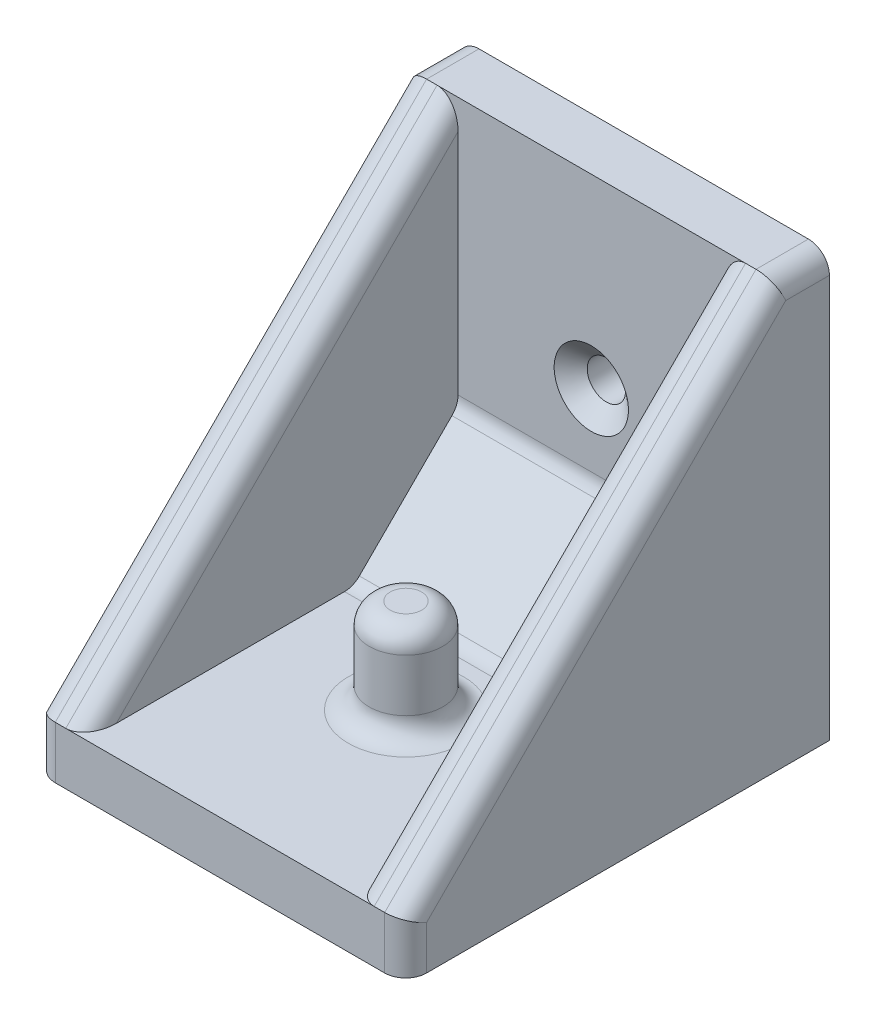
ISO-10303-21;
HEADER;
FILE_DESCRIPTION(('STEP AP214'),'2;1');
FILE_NAME('part.step','',(''),(''),'','','');
FILE_SCHEMA(('AUTOMOTIVE_DESIGN { 1 0 10303 214 1 1 1 1 }'));
ENDSEC;
DATA;
#1=APPLICATION_CONTEXT('core data for automotive mechanical design processes');
#2=APPLICATION_PROTOCOL_DEFINITION('international standard','automotive_design',2000,#1);
#3=PRODUCT_CONTEXT('',#1,'mechanical');
#4=PRODUCT('Part','Part','',(#3));
#5=PRODUCT_RELATED_PRODUCT_CATEGORY('part','',(#4));
#6=PRODUCT_DEFINITION_FORMATION('','',#4);
#7=PRODUCT_DEFINITION_CONTEXT('part definition',#1,'design');
#8=PRODUCT_DEFINITION('design','',#6,#7);
#9=PRODUCT_DEFINITION_SHAPE('','',#8);
#10=(LENGTH_UNIT() NAMED_UNIT(*) SI_UNIT(.MILLI.,.METRE.));
#11=(NAMED_UNIT(*) PLANE_ANGLE_UNIT() SI_UNIT($,.RADIAN.));
#12=(NAMED_UNIT(*) SI_UNIT($,.STERADIAN.) SOLID_ANGLE_UNIT());
#13=UNCERTAINTY_MEASURE_WITH_UNIT(LENGTH_MEASURE(1.E-05),#10,'distance_accuracy_value','');
#14=(GEOMETRIC_REPRESENTATION_CONTEXT(3) GLOBAL_UNCERTAINTY_ASSIGNED_CONTEXT((#13)) GLOBAL_UNIT_ASSIGNED_CONTEXT((#10,
#11,#12)) REPRESENTATION_CONTEXT('',''));
#15=CARTESIAN_POINT('',(0.,0.,0.));
#16=DIRECTION('',(0.,0.,1.));
#17=DIRECTION('',(1.,0.,0.));
#18=AXIS2_PLACEMENT_3D('',#15,#16,#17);
#19=CARTESIAN_POINT('',(0.,0.,5.));
#20=DIRECTION('',(0.,0.,-1.));
#21=DIRECTION('',(-1.,0.,0.));
#22=AXIS2_PLACEMENT_3D('',#19,#20,#21);
#23=PLANE('',#22);
#24=CARTESIAN_POINT('',(17.71,17.71,5.));
#25=DIRECTION('',(0.,0.,1.));
#26=DIRECTION('',(1.,0.,0.));
#27=AXIS2_PLACEMENT_3D('',#24,#25,#26);
#28=CIRCLE('',#27,3.5433);
#29=CARTESIAN_POINT('',(21.2533,17.71,5.));
#30=VERTEX_POINT('',#29);
#31=EDGE_CURVE('E424',#30,#30,#28,.T.);
#32=ORIENTED_EDGE('',*,*,#31,.F.);
#33=EDGE_LOOP('',(#32));
#34=FACE_BOUND('',#33,.T.);
#35=DIRECTION('',(0.,-1.,0.));
#36=VECTOR('',#35,1.);
#37=CARTESIAN_POINT('',(5.,0.,5.));
#38=LINE('',#37,#36);
#39=CARTESIAN_POINT('',(5.,32.5915728752538,5.));
#40=VERTEX_POINT('',#39);
#41=CARTESIAN_POINT('',(5.,10.8284271247463,5.));
#42=VERTEX_POINT('',#41);
#43=EDGE_CURVE('E404',#40,#42,#38,.T.);
#44=ORIENTED_EDGE('',*,*,#43,.T.);
#45=DIRECTION('',(-1.,0.,0.));
#46=VECTOR('',#45,1.);
#47=CARTESIAN_POINT('',(30.42,10.8284271247463,5.));
#48=LINE('',#47,#46);
#49=CARTESIAN_POINT('',(30.42,10.8284271247463,5.));
#50=VERTEX_POINT('',#49);
#51=EDGE_CURVE('E235',#42,#50,#48,.F.);
#52=ORIENTED_EDGE('',*,*,#51,.T.);
#53=DIRECTION('',(0.,1.,0.));
#54=VECTOR('',#53,1.);
#55=CARTESIAN_POINT('',(30.42,35.42,5.));
#56=LINE('',#55,#54);
#57=CARTESIAN_POINT('',(30.42,32.5915728752538,5.));
#58=VERTEX_POINT('',#57);
#59=EDGE_CURVE('E408',#50,#58,#56,.T.);
#60=ORIENTED_EDGE('',*,*,#59,.T.);
#61=CARTESIAN_POINT('',(32.42,32.5915728752538,5.));
#62=DIRECTION('',(0.,0.,-1.));
#63=DIRECTION('',(0.,1.,0.));
#64=AXIS2_PLACEMENT_3D('',#61,#62,#63);
#65=ELLIPSE('',#64,2.82842712474619,2.);
#66=CARTESIAN_POINT('',(32.42,35.42,5.));
#67=VERTEX_POINT('',#66);
#68=EDGE_CURVE('E11',#58,#67,#65,.T.);
#69=ORIENTED_EDGE('',*,*,#68,.T.);
#70=DIRECTION('',(-1.,0.,0.));
#71=VECTOR('',#70,1.);
#72=CARTESIAN_POINT('',(5.,35.42,5.));
#73=LINE('',#72,#71);
#74=CARTESIAN_POINT('',(3.,35.42,5.));
#75=VERTEX_POINT('',#74);
#76=EDGE_CURVE('E204',#67,#75,#73,.T.);
#77=ORIENTED_EDGE('',*,*,#76,.T.);
#78=CARTESIAN_POINT('',(3.,32.5915728752538,5.));
#79=DIRECTION('',(0.,0.,-1.));
#80=DIRECTION('',(0.,-1.,0.));
#81=AXIS2_PLACEMENT_3D('',#78,#79,#80);
#82=ELLIPSE('',#81,2.82842712474616,2.);
#83=EDGE_CURVE('E333',#75,#40,#82,.T.);
#84=ORIENTED_EDGE('',*,*,#83,.T.);
#85=EDGE_LOOP('',(#44,#52,#60,#69,#77,#84));
#86=FACE_BOUND('',#85,.T.);
#87=ADVANCED_FACE('F41',(#34,#86),#23,.F.);
#88=CARTESIAN_POINT('',(0.,0.,0.));
#89=DIRECTION('',(0.,-1.,0.));
#90=DIRECTION('',(0.,0.,-1.));
#91=AXIS2_PLACEMENT_3D('',#88,#89,#90);
#92=PLANE('',#91);
#93=CARTESIAN_POINT('',(17.71,0.,22.6793060430928));
#94=DIRECTION('',(0.,-1.,0.));
#95=DIRECTION('',(0.,0.,-1.));
#96=AXIS2_PLACEMENT_3D('',#93,#94,#95);
#97=CIRCLE('',#96,5.5);
#98=CARTESIAN_POINT('',(17.71,0.,17.1793060430928));
#99=VERTEX_POINT('',#98);
#100=EDGE_CURVE('E263',#99,#99,#97,.T.);
#101=ORIENTED_EDGE('',*,*,#100,.T.);
#102=EDGE_LOOP('',(#101));
#103=FACE_BOUND('',#102,.T.);
#104=DIRECTION('',(0.,0.,-1.));
#105=VECTOR('',#104,1.);
#106=CARTESIAN_POINT('',(30.42,0.,5.));
#107=LINE('',#106,#105);
#108=CARTESIAN_POINT('',(30.42,0.,37.5915728752538));
#109=VERTEX_POINT('',#108);
#110=CARTESIAN_POINT('',(30.42,0.,15.8284271247462));
#111=VERTEX_POINT('',#110);
#112=EDGE_CURVE('E412',#109,#111,#107,.T.);
#113=ORIENTED_EDGE('',*,*,#112,.T.);
#114=DIRECTION('',(1.,0.,0.));
#115=VECTOR('',#114,1.);
#116=CARTESIAN_POINT('',(5.,0.,15.8284271247462));
#117=LINE('',#116,#115);
#118=CARTESIAN_POINT('',(5.,0.,15.8284271247462));
#119=VERTEX_POINT('',#118);
#120=EDGE_CURVE('E267',#111,#119,#117,.F.);
#121=ORIENTED_EDGE('',*,*,#120,.T.);
#122=DIRECTION('',(0.,0.,1.));
#123=VECTOR('',#122,1.);
#124=CARTESIAN_POINT('',(5.,0.,40.4200000000009));
#125=LINE('',#124,#123);
#126=CARTESIAN_POINT('',(5.,0.,37.5915728752546));
#127=VERTEX_POINT('',#126);
#128=EDGE_CURVE('E400',#119,#127,#125,.T.);
#129=ORIENTED_EDGE('',*,*,#128,.T.);
#130=CARTESIAN_POINT('',(3.,0.,37.5915728752546));
#131=DIRECTION('',(0.,-1.,0.));
#132=DIRECTION('',(0.,0.,1.));
#133=AXIS2_PLACEMENT_3D('',#130,#131,#132);
#134=ELLIPSE('',#133,2.82842712474622,2.);
#135=CARTESIAN_POINT('',(3.,0.,40.4200000000009));
#136=VERTEX_POINT('',#135);
#137=EDGE_CURVE('E336',#127,#136,#134,.T.);
#138=ORIENTED_EDGE('',*,*,#137,.T.);
#139=DIRECTION('',(-1.,0.,0.));
#140=VECTOR('',#139,1.);
#141=CARTESIAN_POINT('',(5.,0.,40.4200000000009));
#142=LINE('',#141,#140);
#143=CARTESIAN_POINT('',(32.42,0.,40.42));
#144=VERTEX_POINT('',#143);
#145=EDGE_CURVE('E394',#144,#136,#142,.T.);
#146=ORIENTED_EDGE('',*,*,#145,.F.);
#147=CARTESIAN_POINT('',(32.42,0.,37.5915728752538));
#148=DIRECTION('',(0.,-1.,0.));
#149=DIRECTION('',(0.,0.,-1.));
#150=AXIS2_PLACEMENT_3D('',#147,#148,#149);
#151=ELLIPSE('',#150,2.82842712474619,2.);
#152=EDGE_CURVE('E51',#144,#109,#151,.T.);
#153=ORIENTED_EDGE('',*,*,#152,.T.);
#154=EDGE_LOOP('',(#113,#121,#129,#138,#146,#153));
#155=FACE_BOUND('',#154,.T.);
#156=ADVANCED_FACE('F449',(#103,#155),#92,.F.);
#157=CARTESIAN_POINT('',(0.,0.,5.));
#158=DIRECTION('',(1.,0.,0.));
#159=DIRECTION('',(0.,0.,-1.));
#160=AXIS2_PLACEMENT_3D('',#157,#158,#159);
#161=PLANE('',#160);
#162=DIRECTION('',(0.,0.,-1.));
#163=VECTOR('',#162,1.);
#164=CARTESIAN_POINT('',(0.,-5.,0.));
#165=LINE('',#164,#163);
#166=CARTESIAN_POINT('',(0.,-5.,38.42));
#167=VERTEX_POINT('',#166);
#168=CARTESIAN_POINT('',(0.,-5.,0.));
#169=VERTEX_POINT('',#168);
#170=EDGE_CURVE('E168',#167,#169,#165,.T.);
#171=ORIENTED_EDGE('',*,*,#170,.F.);
#172=DIRECTION('',(0.,1.,0.));
#173=VECTOR('',#172,1.);
#174=CARTESIAN_POINT('',(0.,0.,38.42));
#175=LINE('',#174,#173);
#176=CARTESIAN_POINT('',(0.,-0.828427124745332,38.42));
#177=VERTEX_POINT('',#176);
#178=EDGE_CURVE('E59',#167,#177,#175,.T.);
#179=ORIENTED_EDGE('',*,*,#178,.T.);
#180=DIRECTION('',(0.,0.707106781186539,-0.707106781186556));
#181=VECTOR('',#180,1.);
#182=CARTESIAN_POINT('',(0.,34.0057864376269,3.58578643762692));
#183=LINE('',#182,#181);
#184=CARTESIAN_POINT('',(0.,33.42,4.17157287525382));
#185=VERTEX_POINT('',#184);
#186=EDGE_CURVE('E322',#177,#185,#183,.T.);
#187=ORIENTED_EDGE('',*,*,#186,.T.);
#188=DIRECTION('',(0.,0.,-1.));
#189=VECTOR('',#188,1.);
#190=CARTESIAN_POINT('',(0.,33.42,5.));
#191=LINE('',#190,#189);
#192=CARTESIAN_POINT('',(0.,33.42,0.));
#193=VERTEX_POINT('',#192);
#194=EDGE_CURVE('E169',#185,#193,#191,.T.);
#195=ORIENTED_EDGE('',*,*,#194,.T.);
#196=DIRECTION('',(0.,-1.,0.));
#197=VECTOR('',#196,1.);
#198=CARTESIAN_POINT('',(0.,0.,0.));
#199=LINE('',#198,#197);
#200=EDGE_CURVE('E165',#193,#169,#199,.T.);
#201=ORIENTED_EDGE('',*,*,#200,.T.);
#202=EDGE_LOOP('',(#171,#179,#187,#195,#201));
#203=FACE_BOUND('',#202,.T.);
#204=ADVANCED_FACE('F167',(#203),#161,.F.);
#205=CARTESIAN_POINT('',(35.42,0.,5.));
#206=DIRECTION('',(-1.,0.,0.));
#207=DIRECTION('',(0.,0.,1.));
#208=AXIS2_PLACEMENT_3D('',#205,#206,#207);
#209=PLANE('',#208);
#210=DIRECTION('',(0.,-0.707106781186548,0.707106781186548));
#211=VECTOR('',#210,1.);
#212=CARTESIAN_POINT('',(35.42,-1.4142135623731,39.0057864376269));
#213=LINE('',#212,#211);
#214=CARTESIAN_POINT('',(35.42,33.42,4.17157287525381));
#215=VERTEX_POINT('',#214);
#216=CARTESIAN_POINT('',(35.42,-0.828427124746189,38.42));
#217=VERTEX_POINT('',#216);
#218=EDGE_CURVE('E313',#215,#217,#213,.T.);
#219=ORIENTED_EDGE('',*,*,#218,.T.);
#220=DIRECTION('',(0.,1.,0.));
#221=VECTOR('',#220,1.);
#222=CARTESIAN_POINT('',(35.42,0.,38.42));
#223=LINE('',#222,#221);
#224=CARTESIAN_POINT('',(35.42,-5.,38.42));
#225=VERTEX_POINT('',#224);
#226=EDGE_CURVE('E317',#217,#225,#223,.F.);
#227=ORIENTED_EDGE('',*,*,#226,.T.);
#228=DIRECTION('',(0.,0.,1.));
#229=VECTOR('',#228,1.);
#230=CARTESIAN_POINT('',(35.42,-5.,0.));
#231=LINE('',#230,#229);
#232=CARTESIAN_POINT('',(35.42,-5.,0.));
#233=VERTEX_POINT('',#232);
#234=EDGE_CURVE('E193',#233,#225,#231,.T.);
#235=ORIENTED_EDGE('',*,*,#234,.F.);
#236=DIRECTION('',(0.,1.,0.));
#237=VECTOR('',#236,1.);
#238=CARTESIAN_POINT('',(35.42,0.,0.));
#239=LINE('',#238,#237);
#240=CARTESIAN_POINT('',(35.42,33.42,0.));
#241=VERTEX_POINT('',#240);
#242=EDGE_CURVE('E174',#233,#241,#239,.T.);
#243=ORIENTED_EDGE('',*,*,#242,.T.);
#244=DIRECTION('',(0.,0.,-1.));
#245=VECTOR('',#244,1.);
#246=CARTESIAN_POINT('',(35.42,33.42,5.));
#247=LINE('',#246,#245);
#248=EDGE_CURVE('E310',#241,#215,#247,.F.);
#249=ORIENTED_EDGE('',*,*,#248,.T.);
#250=EDGE_LOOP('',(#219,#227,#235,#243,#249));
#251=FACE_BOUND('',#250,.T.);
#252=ADVANCED_FACE('F466',(#251),#209,.F.);
#253=CARTESIAN_POINT('',(0.,35.42,5.));
#254=DIRECTION('',(0.,-1.,0.));
#255=DIRECTION('',(0.,0.,-1.));
#256=AXIS2_PLACEMENT_3D('',#253,#254,#255);
#257=PLANE('',#256);
#258=DIRECTION('',(-1.,0.,0.));
#259=VECTOR('',#258,1.);
#260=CARTESIAN_POINT('',(0.,35.42,5.));
#261=LINE('',#260,#259);
#262=CARTESIAN_POINT('',(33.42,35.42,5.));
#263=VERTEX_POINT('',#262);
#264=EDGE_CURVE('E205',#263,#67,#261,.T.);
#265=ORIENTED_EDGE('',*,*,#264,.F.);
#266=DIRECTION('',(0.,0.,-1.));
#267=VECTOR('',#266,1.);
#268=CARTESIAN_POINT('',(33.42,35.42,5.));
#269=LINE('',#268,#267);
#270=CARTESIAN_POINT('',(33.42,35.42,0.));
#271=VERTEX_POINT('',#270);
#272=EDGE_CURVE('E294',#263,#271,#269,.T.);
#273=ORIENTED_EDGE('',*,*,#272,.T.);
#274=DIRECTION('',(-1.,0.,0.));
#275=VECTOR('',#274,1.);
#276=CARTESIAN_POINT('',(0.,35.42,0.));
#277=LINE('',#276,#275);
#278=CARTESIAN_POINT('',(2.,35.42,0.));
#279=VERTEX_POINT('',#278);
#280=EDGE_CURVE('E209',#271,#279,#277,.T.);
#281=ORIENTED_EDGE('',*,*,#280,.T.);
#282=DIRECTION('',(0.,0.,-1.));
#283=VECTOR('',#282,1.);
#284=CARTESIAN_POINT('',(2.,35.42,5.));
#285=LINE('',#284,#283);
#286=CARTESIAN_POINT('',(2.,35.42,5.));
#287=VERTEX_POINT('',#286);
#288=EDGE_CURVE('E291',#279,#287,#285,.F.);
#289=ORIENTED_EDGE('',*,*,#288,.T.);
#290=EDGE_CURVE('E389',#75,#287,#73,.T.);
#291=ORIENTED_EDGE('',*,*,#290,.F.);
#292=ORIENTED_EDGE('',*,*,#76,.F.);
#293=EDGE_LOOP('',(#265,#273,#281,#289,#291,#292));
#294=FACE_BOUND('',#293,.T.);
#295=ADVANCED_FACE('F383',(#294),#257,.F.);
#296=CARTESIAN_POINT('',(0.,0.,0.));
#297=DIRECTION('',(0.,0.,-1.));
#298=DIRECTION('',(-1.,0.,0.));
#299=AXIS2_PLACEMENT_3D('',#296,#297,#298);
#300=PLANE('',#299);
#301=CARTESIAN_POINT('',(17.71,17.71,0.));
#302=DIRECTION('',(0.,0.,1.));
#303=DIRECTION('',(1.,0.,0.));
#304=AXIS2_PLACEMENT_3D('',#301,#302,#303);
#305=CIRCLE('',#304,1.82879999999999);
#306=CARTESIAN_POINT('',(19.5388,17.71,0.));
#307=VERTEX_POINT('',#306);
#308=EDGE_CURVE('E416',#307,#307,#305,.T.);
#309=ORIENTED_EDGE('',*,*,#308,.T.);
#310=EDGE_LOOP('',(#309));
#311=FACE_BOUND('',#310,.T.);
#312=ORIENTED_EDGE('',*,*,#280,.F.);
#313=CARTESIAN_POINT('',(33.42,33.42,0.));
#314=DIRECTION('',(0.,0.,-1.));
#315=DIRECTION('',(-1.,0.,0.));
#316=AXIS2_PLACEMENT_3D('',#313,#314,#315);
#317=CIRCLE('',#316,2.);
#318=EDGE_CURVE('E330',#271,#241,#317,.T.);
#319=ORIENTED_EDGE('',*,*,#318,.T.);
#320=ORIENTED_EDGE('',*,*,#242,.F.);
#321=DIRECTION('',(1.,0.,0.));
#322=VECTOR('',#321,1.);
#323=CARTESIAN_POINT('',(0.,-5.,0.));
#324=LINE('',#323,#322);
#325=EDGE_CURVE('E182',#169,#233,#324,.T.);
#326=ORIENTED_EDGE('',*,*,#325,.F.);
#327=ORIENTED_EDGE('',*,*,#200,.F.);
#328=CARTESIAN_POINT('',(2.,33.42,0.));
#329=DIRECTION('',(0.,0.,-1.));
#330=DIRECTION('',(-1.,0.,0.));
#331=AXIS2_PLACEMENT_3D('',#328,#329,#330);
#332=CIRCLE('',#331,2.);
#333=EDGE_CURVE('E327',#193,#279,#332,.T.);
#334=ORIENTED_EDGE('',*,*,#333,.T.);
#335=EDGE_LOOP('',(#312,#319,#320,#326,#327,#334));
#336=FACE_BOUND('',#335,.T.);
#337=ADVANCED_FACE('F190',(#311,#336),#300,.T.);
#338=CARTESIAN_POINT('',(0.,-5.,40.42));
#339=DIRECTION('',(0.,0.,-1.));
#340=DIRECTION('',(-1.,0.,0.));
#341=AXIS2_PLACEMENT_3D('',#338,#339,#340);
#342=PLANE('',#341);
#343=CARTESIAN_POINT('',(2.,0.,40.4200000000009));
#344=VERTEX_POINT('',#343);
#345=EDGE_CURVE('E361',#136,#344,#142,.T.);
#346=ORIENTED_EDGE('',*,*,#345,.T.);
#347=DIRECTION('',(0.,1.,0.));
#348=VECTOR('',#347,1.);
#349=CARTESIAN_POINT('',(2.,-5.,40.42));
#350=LINE('',#349,#348);
#351=CARTESIAN_POINT('',(2.,-5.,40.42));
#352=VERTEX_POINT('',#351);
#353=EDGE_CURVE('E300',#344,#352,#350,.F.);
#354=ORIENTED_EDGE('',*,*,#353,.T.);
#355=DIRECTION('',(-1.,0.,0.));
#356=VECTOR('',#355,1.);
#357=CARTESIAN_POINT('',(0.,-5.,40.42));
#358=LINE('',#357,#356);
#359=CARTESIAN_POINT('',(33.42,-5.,40.42));
#360=VERTEX_POINT('',#359);
#361=EDGE_CURVE('E175',#360,#352,#358,.T.);
#362=ORIENTED_EDGE('',*,*,#361,.F.);
#363=DIRECTION('',(0.,1.,0.));
#364=VECTOR('',#363,1.);
#365=CARTESIAN_POINT('',(33.42,-5.,40.42));
#366=LINE('',#365,#364);
#367=CARTESIAN_POINT('',(33.42,0.,40.42));
#368=VERTEX_POINT('',#367);
#369=EDGE_CURVE('E297',#360,#368,#366,.T.);
#370=ORIENTED_EDGE('',*,*,#369,.T.);
#371=DIRECTION('',(-1.,0.,0.));
#372=VECTOR('',#371,1.);
#373=CARTESIAN_POINT('',(0.,0.,40.42));
#374=LINE('',#373,#372);
#375=EDGE_CURVE('E187',#368,#144,#374,.T.);
#376=ORIENTED_EDGE('',*,*,#375,.T.);
#377=ORIENTED_EDGE('',*,*,#145,.T.);
#378=EDGE_LOOP('',(#346,#354,#362,#370,#376,#377));
#379=FACE_BOUND('',#378,.T.);
#380=ADVANCED_FACE('F357',(#379),#342,.F.);
#381=CARTESIAN_POINT('',(0.,-5.,0.));
#382=DIRECTION('',(0.,-1.,0.));
#383=DIRECTION('',(0.,0.,-1.));
#384=AXIS2_PLACEMENT_3D('',#381,#382,#383);
#385=PLANE('',#384);
#386=CARTESIAN_POINT('',(17.71,-5.,22.6793060430928));
#387=DIRECTION('',(0.,-1.,0.));
#388=DIRECTION('',(0.,0.,-1.));
#389=AXIS2_PLACEMENT_3D('',#386,#387,#388);
#390=CIRCLE('',#389,3.1);
#391=CARTESIAN_POINT('',(17.71,-5.,19.5793060430928));
#392=VERTEX_POINT('',#391);
#393=EDGE_CURVE('E276',#392,#392,#390,.F.);
#394=ORIENTED_EDGE('',*,*,#393,.T.);
#395=EDGE_LOOP('',(#394));
#396=FACE_BOUND('',#395,.T.);
#397=ORIENTED_EDGE('',*,*,#361,.T.);
#398=CARTESIAN_POINT('',(2.,-5.,38.42));
#399=DIRECTION('',(0.,-1.,0.));
#400=DIRECTION('',(0.,0.,-1.));
#401=AXIS2_PLACEMENT_3D('',#398,#399,#400);
#402=CIRCLE('',#401,2.);
#403=EDGE_CURVE('E185',#352,#167,#402,.T.);
#404=ORIENTED_EDGE('',*,*,#403,.T.);
#405=ORIENTED_EDGE('',*,*,#170,.T.);
#406=ORIENTED_EDGE('',*,*,#325,.T.);
#407=ORIENTED_EDGE('',*,*,#234,.T.);
#408=CARTESIAN_POINT('',(33.42,-5.,38.42));
#409=DIRECTION('',(0.,-1.,0.));
#410=DIRECTION('',(0.,0.,-1.));
#411=AXIS2_PLACEMENT_3D('',#408,#409,#410);
#412=CIRCLE('',#411,2.);
#413=EDGE_CURVE('E271',#225,#360,#412,.T.);
#414=ORIENTED_EDGE('',*,*,#413,.T.);
#415=EDGE_LOOP('',(#397,#404,#405,#406,#407,#414));
#416=FACE_BOUND('',#415,.T.);
#417=ADVANCED_FACE('F180',(#396,#416),#385,.T.);
#418=CARTESIAN_POINT('',(5.,35.42,5.));
#419=DIRECTION('',(0.,0.707106781186556,0.707106781186539));
#420=DIRECTION('',(0.,-0.707106781186539,0.707106781186556));
#421=AXIS2_PLACEMENT_3D('',#418,#419,#420);
#422=PLANE('',#421);
#423=ORIENTED_EDGE('',*,*,#345,.F.);
#424=DIRECTION('',(0.,0.707106781186539,-0.707106781186556));
#425=VECTOR('',#424,1.);
#426=CARTESIAN_POINT('',(3.,35.42,5.));
#427=LINE('',#426,#425);
#428=EDGE_CURVE('E287',#136,#75,#427,.T.);
#429=ORIENTED_EDGE('',*,*,#428,.T.);
#430=ORIENTED_EDGE('',*,*,#290,.T.);
#431=DIRECTION('',(0.,0.707106781186539,-0.707106781186556));
#432=VECTOR('',#431,1.);
#433=CARTESIAN_POINT('',(2.,0.,40.4200000000009));
#434=LINE('',#433,#432);
#435=EDGE_CURVE('E284',#287,#344,#434,.F.);
#436=ORIENTED_EDGE('',*,*,#435,.T.);
#437=EDGE_LOOP('',(#423,#429,#430,#436));
#438=FACE_BOUND('',#437,.T.);
#439=ADVANCED_FACE('F391',(#438),#422,.T.);
#440=CARTESIAN_POINT('',(5.,0.,0.));
#441=DIRECTION('',(-1.,0.,0.));
#442=DIRECTION('',(0.,0.,1.));
#443=AXIS2_PLACEMENT_3D('',#440,#441,#442);
#444=PLANE('',#443);
#445=DIRECTION('',(0.,-0.707106781186551,0.707106781186544));
#446=VECTOR('',#445,1.);
#447=CARTESIAN_POINT('',(5.,10.0000000000001,5.));
#448=LINE('',#447,#446);
#449=CARTESIAN_POINT('',(5.,0.585786437626914,14.4142135623731));
#450=VERTEX_POINT('',#449);
#451=CARTESIAN_POINT('',(5.,9.41421356237317,5.5857864376269));
#452=VERTEX_POINT('',#451);
#453=EDGE_CURVE('E219',#450,#452,#448,.F.);
#454=ORIENTED_EDGE('',*,*,#453,.T.);
#455=CARTESIAN_POINT('',(5.,10.8284271247463,7.));
#456=DIRECTION('',(-1.,0.,0.));
#457=DIRECTION('',(0.,0.,1.));
#458=AXIS2_PLACEMENT_3D('',#455,#456,#457);
#459=CIRCLE('',#458,2.);
#460=EDGE_CURVE('E260',#452,#42,#459,.F.);
#461=ORIENTED_EDGE('',*,*,#460,.T.);
#462=ORIENTED_EDGE('',*,*,#43,.F.);
#463=DIRECTION('',(0.,0.707106781186539,-0.707106781186556));
#464=VECTOR('',#463,1.);
#465=CARTESIAN_POINT('',(5.,-1.41421356237311,39.0057864376278));
#466=LINE('',#465,#464);
#467=EDGE_CURVE('E254',#40,#127,#466,.F.);
#468=ORIENTED_EDGE('',*,*,#467,.T.);
#469=ORIENTED_EDGE('',*,*,#128,.F.);
#470=CARTESIAN_POINT('',(5.,2.,15.8284271247462));
#471=DIRECTION('',(-1.,0.,0.));
#472=DIRECTION('',(0.,0.,1.));
#473=AXIS2_PLACEMENT_3D('',#470,#471,#472);
#474=CIRCLE('',#473,2.);
#475=EDGE_CURVE('E257',#119,#450,#474,.F.);
#476=ORIENTED_EDGE('',*,*,#475,.T.);
#477=EDGE_LOOP('',(#454,#461,#462,#468,#469,#476));
#478=FACE_BOUND('',#477,.T.);
#479=ADVANCED_FACE('F606',(#478),#444,.F.);
#480=CARTESIAN_POINT('',(30.42,0.,40.42));
#481=DIRECTION('',(0.,0.707106781186548,0.707106781186548));
#482=DIRECTION('',(0.,-0.707106781186548,0.707106781186548));
#483=AXIS2_PLACEMENT_3D('',#480,#481,#482);
#484=PLANE('',#483);
#485=ORIENTED_EDGE('',*,*,#264,.T.);
#486=DIRECTION('',(0.,-0.707106781186548,0.707106781186548));
#487=VECTOR('',#486,1.);
#488=CARTESIAN_POINT('',(32.42,0.,40.42));
#489=LINE('',#488,#487);
#490=EDGE_CURVE('E306',#67,#144,#489,.T.);
#491=ORIENTED_EDGE('',*,*,#490,.T.);
#492=ORIENTED_EDGE('',*,*,#375,.F.);
#493=DIRECTION('',(0.,-0.707106781186548,0.707106781186548));
#494=VECTOR('',#493,1.);
#495=CARTESIAN_POINT('',(33.42,35.42,5.));
#496=LINE('',#495,#494);
#497=EDGE_CURVE('E303',#368,#263,#496,.F.);
#498=ORIENTED_EDGE('',*,*,#497,.T.);
#499=EDGE_LOOP('',(#485,#491,#492,#498));
#500=FACE_BOUND('',#499,.T.);
#501=ADVANCED_FACE('F370',(#500),#484,.T.);
#502=CARTESIAN_POINT('',(30.42,0.,0.));
#503=DIRECTION('',(1.,0.,0.));
#504=DIRECTION('',(0.,0.,-1.));
#505=AXIS2_PLACEMENT_3D('',#502,#503,#504);
#506=PLANE('',#505);
#507=ORIENTED_EDGE('',*,*,#59,.F.);
#508=CARTESIAN_POINT('',(30.42,10.8284271247463,7.));
#509=DIRECTION('',(1.,0.,0.));
#510=DIRECTION('',(0.,0.,-1.));
#511=AXIS2_PLACEMENT_3D('',#508,#509,#510);
#512=CIRCLE('',#511,2.);
#513=CARTESIAN_POINT('',(30.42,9.41421356237317,5.5857864376269));
#514=VERTEX_POINT('',#513);
#515=EDGE_CURVE('E245',#50,#514,#512,.F.);
#516=ORIENTED_EDGE('',*,*,#515,.T.);
#517=DIRECTION('',(0.,0.707106781186551,-0.707106781186544));
#518=VECTOR('',#517,1.);
#519=CARTESIAN_POINT('',(30.42,10.0000000000001,5.));
#520=LINE('',#519,#518);
#521=CARTESIAN_POINT('',(30.42,0.585786437626914,14.4142135623731));
#522=VERTEX_POINT('',#521);
#523=EDGE_CURVE('E208',#514,#522,#520,.F.);
#524=ORIENTED_EDGE('',*,*,#523,.T.);
#525=CARTESIAN_POINT('',(30.42,2.,15.8284271247462));
#526=DIRECTION('',(1.,0.,0.));
#527=DIRECTION('',(0.,0.,-1.));
#528=AXIS2_PLACEMENT_3D('',#525,#526,#527);
#529=CIRCLE('',#528,2.);
#530=EDGE_CURVE('E242',#522,#111,#529,.F.);
#531=ORIENTED_EDGE('',*,*,#530,.T.);
#532=ORIENTED_EDGE('',*,*,#112,.F.);
#533=DIRECTION('',(0.,-0.707106781186548,0.707106781186548));
#534=VECTOR('',#533,1.);
#535=CARTESIAN_POINT('',(30.42,34.0057864376269,3.58578643762689));
#536=LINE('',#535,#534);
#537=EDGE_CURVE('E239',#109,#58,#536,.F.);
#538=ORIENTED_EDGE('',*,*,#537,.T.);
#539=EDGE_LOOP('',(#507,#516,#524,#531,#532,#538));
#540=FACE_BOUND('',#539,.T.);
#541=ADVANCED_FACE('F589',(#540),#506,.F.);
#542=CARTESIAN_POINT('',(17.71,17.71,5.));
#543=DIRECTION('',(0.,0.,1.));
#544=DIRECTION('',(1.,0.,0.));
#545=AXIS2_PLACEMENT_3D('',#542,#543,#544);
#546=CYLINDRICAL_SURFACE('',#545,1.82879999999999);
#547=ORIENTED_EDGE('',*,*,#308,.F.);
#548=EDGE_LOOP('',(#547));
#549=FACE_BOUND('',#548,.T.);
#550=CARTESIAN_POINT('',(17.71,17.71,3.56136368234658));
#551=DIRECTION('',(0.,0.,1.));
#552=DIRECTION('',(1.,0.,0.));
#553=AXIS2_PLACEMENT_3D('',#550,#551,#552);
#554=CIRCLE('',#553,1.82879999999999);
#555=CARTESIAN_POINT('',(19.5388,17.71,3.56136368234658));
#556=VERTEX_POINT('',#555);
#557=EDGE_CURVE('E420',#556,#556,#554,.T.);
#558=ORIENTED_EDGE('',*,*,#557,.T.);
#559=EDGE_LOOP('',(#558));
#560=FACE_BOUND('',#559,.T.);
#561=ADVANCED_FACE('F594',(#549,#560),#546,.F.);
#562=CARTESIAN_POINT('',(17.71,17.71,5.));
#563=DIRECTION('',(0.,0.,1.));
#564=DIRECTION('',(1.,0.,0.));
#565=AXIS2_PLACEMENT_3D('',#562,#563,#564);
#566=CONICAL_SURFACE('',#565,3.5433,0.872664625997175);
#567=ORIENTED_EDGE('',*,*,#557,.F.);
#568=EDGE_LOOP('',(#567));
#569=FACE_BOUND('',#568,.T.);
#570=ORIENTED_EDGE('',*,*,#31,.T.);
#571=EDGE_LOOP('',(#570));
#572=FACE_BOUND('',#571,.T.);
#573=ADVANCED_FACE('F581',(#569,#572),#566,.F.);
#574=CARTESIAN_POINT('',(17.71,9.,22.6793060430928));
#575=DIRECTION('',(0.,-1.,0.));
#576=DIRECTION('',(0.,0.,-1.));
#577=AXIS2_PLACEMENT_3D('',#574,#575,#576);
#578=CYLINDRICAL_SURFACE('',#577,3.5);
#579=CARTESIAN_POINT('',(17.71,7.,22.6793060430928));
#580=DIRECTION('',(0.,1.,0.));
#581=DIRECTION('',(0.,0.,1.));
#582=AXIS2_PLACEMENT_3D('',#579,#580,#581);
#583=CIRCLE('',#582,3.5);
#584=CARTESIAN_POINT('',(17.71,7.,26.1793060430928));
#585=VERTEX_POINT('',#584);
#586=EDGE_CURVE('E231',#585,#585,#583,.F.);
#587=ORIENTED_EDGE('',*,*,#586,.T.);
#588=EDGE_LOOP('',(#587));
#589=FACE_BOUND('',#588,.T.);
#590=CARTESIAN_POINT('',(17.71,2.,22.6793060430928));
#591=DIRECTION('',(0.,-1.,0.));
#592=DIRECTION('',(0.,0.,-1.));
#593=AXIS2_PLACEMENT_3D('',#590,#591,#592);
#594=CIRCLE('',#593,3.5);
#595=CARTESIAN_POINT('',(17.71,2.,19.1793060430928));
#596=VERTEX_POINT('',#595);
#597=EDGE_CURVE('E227',#596,#596,#594,.F.);
#598=ORIENTED_EDGE('',*,*,#597,.T.);
#599=EDGE_LOOP('',(#598));
#600=FACE_BOUND('',#599,.T.);
#601=ADVANCED_FACE('F445',(#589,#600),#578,.T.);
#602=CARTESIAN_POINT('',(0.,9.,0.));
#603=DIRECTION('',(0.,1.,0.));
#604=DIRECTION('',(0.,0.,1.));
#605=AXIS2_PLACEMENT_3D('',#602,#603,#604);
#606=PLANE('',#605);
#607=CARTESIAN_POINT('',(17.71,9.,22.6793060430928));
#608=DIRECTION('',(0.,1.,0.));
#609=DIRECTION('',(0.,0.,1.));
#610=AXIS2_PLACEMENT_3D('',#607,#608,#609);
#611=CIRCLE('',#610,1.5);
#612=CARTESIAN_POINT('',(17.71,9.,24.1793060430928));
#613=VERTEX_POINT('',#612);
#614=EDGE_CURVE('E223',#613,#613,#611,.T.);
#615=ORIENTED_EDGE('',*,*,#614,.T.);
#616=EDGE_LOOP('',(#615));
#617=FACE_BOUND('',#616,.T.);
#618=ADVANCED_FACE('F436',(#617),#606,.T.);
#619=CARTESIAN_POINT('',(17.71,4.,22.6793060430928));
#620=DIRECTION('',(0.,1.,0.));
#621=DIRECTION('',(0.,0.,1.));
#622=AXIS2_PLACEMENT_3D('',#619,#620,#621);
#623=PLANE('',#622);
#624=CARTESIAN_POINT('',(17.71,4.,22.6793060430928));
#625=DIRECTION('',(0.,1.,0.));
#626=DIRECTION('',(0.,0.,1.));
#627=AXIS2_PLACEMENT_3D('',#624,#625,#626);
#628=CIRCLE('',#627,1.1);
#629=CARTESIAN_POINT('',(17.71,4.,23.7793060430928));
#630=VERTEX_POINT('',#629);
#631=EDGE_CURVE('E347',#630,#630,#628,.T.);
#632=ORIENTED_EDGE('',*,*,#631,.F.);
#633=EDGE_LOOP('',(#632));
#634=FACE_BOUND('',#633,.T.);
#635=ADVANCED_FACE('F434',(#634),#623,.F.);
#636=CARTESIAN_POINT('',(17.71,-8.11126983722081,22.6793060430928));
#637=DIRECTION('',(0.,1.,0.));
#638=DIRECTION('',(0.,0.,1.));
#639=AXIS2_PLACEMENT_3D('',#636,#637,#638);
#640=CYLINDRICAL_SURFACE('',#639,1.1);
#641=CARTESIAN_POINT('',(17.71,-3.,22.6793060430928));
#642=DIRECTION('',(0.,-1.,0.));
#643=DIRECTION('',(0.,0.,-1.));
#644=AXIS2_PLACEMENT_3D('',#641,#642,#643);
#645=CIRCLE('',#644,1.1);
#646=CARTESIAN_POINT('',(17.71,-3.,21.5793060430928));
#647=VERTEX_POINT('',#646);
#648=EDGE_CURVE('E280',#647,#647,#645,.T.);
#649=ORIENTED_EDGE('',*,*,#648,.T.);
#650=EDGE_LOOP('',(#649));
#651=FACE_BOUND('',#650,.T.);
#652=ORIENTED_EDGE('',*,*,#631,.T.);
#653=EDGE_LOOP('',(#652));
#654=FACE_BOUND('',#653,.T.);
#655=ADVANCED_FACE('F432',(#651,#654),#640,.F.);
#656=CARTESIAN_POINT('',(0.,10.0000000000001,5.));
#657=DIRECTION('',(0.,0.707106781186544,0.707106781186551));
#658=DIRECTION('',(-1.,0.,0.));
#659=AXIS2_PLACEMENT_3D('',#656,#657,#658);
#660=PLANE('',#659);
#661=ORIENTED_EDGE('',*,*,#523,.F.);
#662=DIRECTION('',(1.,0.,0.));
#663=VECTOR('',#662,1.);
#664=CARTESIAN_POINT('',(5.,9.41421356237317,5.5857864376269));
#665=LINE('',#664,#663);
#666=EDGE_CURVE('E251',#514,#452,#665,.F.);
#667=ORIENTED_EDGE('',*,*,#666,.T.);
#668=ORIENTED_EDGE('',*,*,#453,.F.);
#669=DIRECTION('',(-1.,0.,0.));
#670=VECTOR('',#669,1.);
#671=CARTESIAN_POINT('',(30.42,0.585786437626914,14.4142135623731));
#672=LINE('',#671,#670);
#673=EDGE_CURVE('E248',#450,#522,#672,.F.);
#674=ORIENTED_EDGE('',*,*,#673,.T.);
#675=EDGE_LOOP('',(#661,#667,#668,#674));
#676=FACE_BOUND('',#675,.T.);
#677=ADVANCED_FACE('F442',(#676),#660,.T.);
#678=CARTESIAN_POINT('',(17.71,7.,22.6793060430928));
#679=DIRECTION('',(0.,1.,0.));
#680=DIRECTION('',(0.,0.,1.));
#681=AXIS2_PLACEMENT_3D('',#678,#679,#680);
#682=DEGENERATE_TOROIDAL_SURFACE('',#681,1.5,2.,.T.);
#683=ORIENTED_EDGE('',*,*,#586,.F.);
#684=EDGE_LOOP('',(#683));
#685=FACE_BOUND('',#684,.T.);
#686=ORIENTED_EDGE('',*,*,#614,.F.);
#687=EDGE_LOOP('',(#686));
#688=FACE_BOUND('',#687,.T.);
#689=ADVANCED_FACE('F474',(#685,#688),#682,.T.);
#690=CARTESIAN_POINT('',(0.,10.8284271247463,7.));
#691=DIRECTION('',(1.,0.,0.));
#692=DIRECTION('',(0.,0.,-1.));
#693=AXIS2_PLACEMENT_3D('',#690,#691,#692);
#694=CYLINDRICAL_SURFACE('',#693,2.);
#695=ORIENTED_EDGE('',*,*,#460,.F.);
#696=ORIENTED_EDGE('',*,*,#666,.F.);
#697=ORIENTED_EDGE('',*,*,#515,.F.);
#698=ORIENTED_EDGE('',*,*,#51,.F.);
#699=EDGE_LOOP('',(#695,#696,#697,#698));
#700=FACE_BOUND('',#699,.T.);
#701=ADVANCED_FACE('F478',(#700),#694,.F.);
#702=CARTESIAN_POINT('',(0.,2.,15.8284271247462));
#703=DIRECTION('',(-1.,0.,0.));
#704=DIRECTION('',(0.,0.,1.));
#705=AXIS2_PLACEMENT_3D('',#702,#703,#704);
#706=CYLINDRICAL_SURFACE('',#705,2.);
#707=ORIENTED_EDGE('',*,*,#530,.F.);
#708=ORIENTED_EDGE('',*,*,#673,.F.);
#709=ORIENTED_EDGE('',*,*,#475,.F.);
#710=ORIENTED_EDGE('',*,*,#120,.F.);
#711=EDGE_LOOP('',(#707,#708,#709,#710));
#712=FACE_BOUND('',#711,.T.);
#713=ADVANCED_FACE('F482',(#712),#706,.F.);
#714=CARTESIAN_POINT('',(17.71,2.,22.6793060430928));
#715=DIRECTION('',(0.,-1.,0.));
#716=DIRECTION('',(0.,0.,-1.));
#717=AXIS2_PLACEMENT_3D('',#714,#715,#716);
#718=TOROIDAL_SURFACE('',#717,5.5,2.);
#719=ORIENTED_EDGE('',*,*,#100,.F.);
#720=EDGE_LOOP('',(#719));
#721=FACE_BOUND('',#720,.T.);
#722=ORIENTED_EDGE('',*,*,#597,.F.);
#723=EDGE_LOOP('',(#722));
#724=FACE_BOUND('',#723,.T.);
#725=ADVANCED_FACE('F486',(#721,#724),#718,.F.);
#726=CARTESIAN_POINT('',(17.71,-3.,22.6793060430928));
#727=DIRECTION('',(0.,-1.,0.));
#728=DIRECTION('',(0.,0.,-1.));
#729=AXIS2_PLACEMENT_3D('',#726,#727,#728);
#730=TOROIDAL_SURFACE('',#729,3.1,2.);
#731=ORIENTED_EDGE('',*,*,#648,.F.);
#732=EDGE_LOOP('',(#731));
#733=FACE_BOUND('',#732,.T.);
#734=ORIENTED_EDGE('',*,*,#393,.F.);
#735=EDGE_LOOP('',(#734));
#736=FACE_BOUND('',#735,.T.);
#737=ADVANCED_FACE('F490',(#733,#736),#730,.T.);
#738=CARTESIAN_POINT('',(3.,34.0057864376269,3.58578643762692));
#739=DIRECTION('',(0.,-0.707106781186539,0.707106781186556));
#740=DIRECTION('',(0.,-0.707106781186556,-0.707106781186539));
#741=AXIS2_PLACEMENT_3D('',#738,#739,#740);
#742=CYLINDRICAL_SURFACE('',#741,2.);
#743=ORIENTED_EDGE('',*,*,#137,.F.);
#744=ORIENTED_EDGE('',*,*,#467,.F.);
#745=ORIENTED_EDGE('',*,*,#83,.F.);
#746=ORIENTED_EDGE('',*,*,#428,.F.);
#747=EDGE_LOOP('',(#743,#744,#745,#746));
#748=FACE_BOUND('',#747,.T.);
#749=ADVANCED_FACE('F494',(#748),#742,.T.);
#750=CARTESIAN_POINT('',(32.42,-1.4142135623731,39.0057864376269));
#751=DIRECTION('',(0.,0.707106781186548,-0.707106781186548));
#752=DIRECTION('',(0.,0.707106781186548,0.707106781186548));
#753=AXIS2_PLACEMENT_3D('',#750,#751,#752);
#754=CYLINDRICAL_SURFACE('',#753,2.);
#755=ORIENTED_EDGE('',*,*,#68,.F.);
#756=ORIENTED_EDGE('',*,*,#537,.F.);
#757=ORIENTED_EDGE('',*,*,#152,.F.);
#758=ORIENTED_EDGE('',*,*,#490,.F.);
#759=EDGE_LOOP('',(#755,#756,#757,#758));
#760=FACE_BOUND('',#759,.T.);
#761=ADVANCED_FACE('F498',(#760),#754,.T.);
#762=CARTESIAN_POINT('',(33.42,33.42,5.));
#763=DIRECTION('',(0.,0.,-1.));
#764=DIRECTION('',(-1.,0.,0.));
#765=AXIS2_PLACEMENT_3D('',#762,#763,#764);
#766=CYLINDRICAL_SURFACE('',#765,2.);
#767=ORIENTED_EDGE('',*,*,#318,.F.);
#768=ORIENTED_EDGE('',*,*,#272,.F.);
#769=CARTESIAN_POINT('',(33.42,33.42,4.17157287525381));
#770=DIRECTION('',(0.,0.38268343236509,-0.923879532511287));
#771=DIRECTION('',(0.,-0.923879532511287,-0.38268343236509));
#772=AXIS2_PLACEMENT_3D('',#769,#770,#771);
#773=ELLIPSE('',#772,2.16478440058479,2.);
#774=EDGE_CURVE('E344',#215,#263,#773,.F.);
#775=ORIENTED_EDGE('',*,*,#774,.F.);
#776=ORIENTED_EDGE('',*,*,#248,.F.);
#777=EDGE_LOOP('',(#767,#768,#775,#776));
#778=FACE_BOUND('',#777,.T.);
#779=ADVANCED_FACE('F381',(#778),#766,.T.);
#780=CARTESIAN_POINT('',(33.42,-5.,38.42));
#781=DIRECTION('',(0.,1.,0.));
#782=DIRECTION('',(0.,0.,1.));
#783=AXIS2_PLACEMENT_3D('',#780,#781,#782);
#784=CYLINDRICAL_SURFACE('',#783,2.);
#785=ORIENTED_EDGE('',*,*,#413,.F.);
#786=ORIENTED_EDGE('',*,*,#226,.F.);
#787=CARTESIAN_POINT('',(33.42,-0.828427124746194,38.42));
#788=DIRECTION('',(0.,0.923879532511287,-0.38268343236509));
#789=DIRECTION('',(0.,0.38268343236509,0.923879532511287));
#790=AXIS2_PLACEMENT_3D('',#787,#788,#789);
#791=ELLIPSE('',#790,2.16478440058479,2.);
#792=EDGE_CURVE('E341',#368,#217,#791,.T.);
#793=ORIENTED_EDGE('',*,*,#792,.F.);
#794=ORIENTED_EDGE('',*,*,#369,.F.);
#795=EDGE_LOOP('',(#785,#786,#793,#794));
#796=FACE_BOUND('',#795,.T.);
#797=ADVANCED_FACE('F365',(#796),#784,.T.);
#798=CARTESIAN_POINT('',(33.42,16.2957864376269,21.2957864376269));
#799=DIRECTION('',(0.,0.707106781186548,-0.707106781186548));
#800=DIRECTION('',(0.,0.707106781186548,0.707106781186548));
#801=AXIS2_PLACEMENT_3D('',#798,#799,#800);
#802=CYLINDRICAL_SURFACE('',#801,2.);
#803=ORIENTED_EDGE('',*,*,#774,.T.);
#804=ORIENTED_EDGE('',*,*,#497,.F.);
#805=ORIENTED_EDGE('',*,*,#792,.T.);
#806=ORIENTED_EDGE('',*,*,#218,.F.);
#807=EDGE_LOOP('',(#803,#804,#805,#806));
#808=FACE_BOUND('',#807,.T.);
#809=ADVANCED_FACE('F374',(#808),#802,.T.);
#810=CARTESIAN_POINT('',(2.,0.,38.42));
#811=DIRECTION('',(0.,1.,0.));
#812=DIRECTION('',(0.,0.,1.));
#813=AXIS2_PLACEMENT_3D('',#810,#811,#812);
#814=CYLINDRICAL_SURFACE('',#813,2.);
#815=ORIENTED_EDGE('',*,*,#403,.F.);
#816=ORIENTED_EDGE('',*,*,#353,.F.);
#817=CARTESIAN_POINT('',(2.,-0.828427124745341,38.42));
#818=DIRECTION('',(0.,0.923879532511285,-0.382683432365095));
#819=DIRECTION('',(0.,0.382683432365095,0.923879532511285));
#820=AXIS2_PLACEMENT_3D('',#817,#818,#819);
#821=ELLIPSE('',#820,2.16478440058479,2.);
#822=EDGE_CURVE('E45',#177,#344,#821,.T.);
#823=ORIENTED_EDGE('',*,*,#822,.F.);
#824=ORIENTED_EDGE('',*,*,#178,.F.);
#825=EDGE_LOOP('',(#815,#816,#823,#824));
#826=FACE_BOUND('',#825,.T.);
#827=ADVANCED_FACE('F43',(#826),#814,.T.);
#828=CARTESIAN_POINT('',(2.,33.42,5.));
#829=DIRECTION('',(0.,0.,-1.));
#830=DIRECTION('',(-1.,0.,0.));
#831=AXIS2_PLACEMENT_3D('',#828,#829,#830);
#832=CYLINDRICAL_SURFACE('',#831,2.);
#833=ORIENTED_EDGE('',*,*,#333,.F.);
#834=ORIENTED_EDGE('',*,*,#194,.F.);
#835=CARTESIAN_POINT('',(2.,33.42,4.17157287525382));
#836=DIRECTION('',(0.,0.382683432365084,-0.923879532511289));
#837=DIRECTION('',(0.,-0.923879532511289,-0.382683432365084));
#838=AXIS2_PLACEMENT_3D('',#835,#836,#837);
#839=ELLIPSE('',#838,2.16478440058478,2.);
#840=EDGE_CURVE('E67',#287,#185,#839,.F.);
#841=ORIENTED_EDGE('',*,*,#840,.F.);
#842=ORIENTED_EDGE('',*,*,#288,.F.);
#843=EDGE_LOOP('',(#833,#834,#841,#842));
#844=FACE_BOUND('',#843,.T.);
#845=ADVANCED_FACE('F386',(#844),#832,.T.);
#846=CARTESIAN_POINT('',(2.,16.2957864376273,21.2957864376269));
#847=DIRECTION('',(0.,-0.707106781186539,0.707106781186556));
#848=DIRECTION('',(0.,-0.707106781186556,-0.707106781186539));
#849=AXIS2_PLACEMENT_3D('',#846,#847,#848);
#850=CYLINDRICAL_SURFACE('',#849,2.);
#851=ORIENTED_EDGE('',*,*,#822,.T.);
#852=ORIENTED_EDGE('',*,*,#435,.F.);
#853=ORIENTED_EDGE('',*,*,#840,.T.);
#854=ORIENTED_EDGE('',*,*,#186,.F.);
#855=EDGE_LOOP('',(#851,#852,#853,#854));
#856=FACE_BOUND('',#855,.T.);
#857=ADVANCED_FACE('F351',(#856),#850,.T.);
#858=CLOSED_SHELL('',(#87,#156,#204,#252,#295,#337,#380,#417,#439,#479,#501,#541,#561,#573,#601,
#618,#635,#655,#677,#689,#701,#713,#725,#737,#749,#761,#779,#797,#809,#827,#845,#857));
#859=MANIFOLD_SOLID_BREP('B2',#858);
#860=ADVANCED_BREP_SHAPE_REPRESENTATION('',(#18,#859),#14);
#861=SHAPE_DEFINITION_REPRESENTATION(#9,#860);
ENDSEC;
END-ISO-10303-21;
